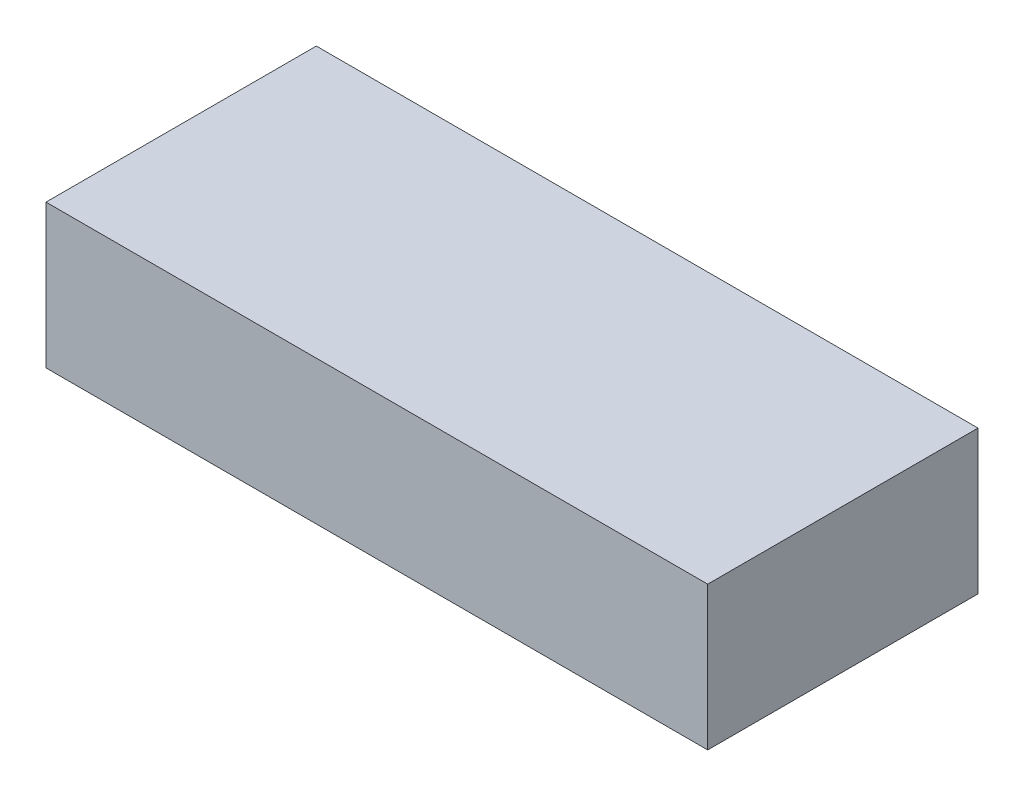
ISO-10303-21;
HEADER;
FILE_DESCRIPTION(('STEP AP214'),'2;1');
FILE_NAME('part.step','',(''),(''),'','','');
FILE_SCHEMA(('AUTOMOTIVE_DESIGN { 1 0 10303 214 1 1 1 1 }'));
ENDSEC;
DATA;
#1=APPLICATION_CONTEXT('core data for automotive mechanical design processes');
#2=APPLICATION_PROTOCOL_DEFINITION('international standard','automotive_design',2000,#1);
#3=PRODUCT_CONTEXT('',#1,'mechanical');
#4=PRODUCT('Part','Part','',(#3));
#5=PRODUCT_RELATED_PRODUCT_CATEGORY('part','',(#4));
#6=PRODUCT_DEFINITION_FORMATION('','',#4);
#7=PRODUCT_DEFINITION_CONTEXT('part definition',#1,'design');
#8=PRODUCT_DEFINITION('design','',#6,#7);
#9=PRODUCT_DEFINITION_SHAPE('','',#8);
#10=(LENGTH_UNIT() NAMED_UNIT(*) SI_UNIT(.MILLI.,.METRE.));
#11=(NAMED_UNIT(*) PLANE_ANGLE_UNIT() SI_UNIT($,.RADIAN.));
#12=(NAMED_UNIT(*) SI_UNIT($,.STERADIAN.) SOLID_ANGLE_UNIT());
#13=UNCERTAINTY_MEASURE_WITH_UNIT(LENGTH_MEASURE(1.E-05),#10,'distance_accuracy_value','');
#14=(GEOMETRIC_REPRESENTATION_CONTEXT(3) GLOBAL_UNCERTAINTY_ASSIGNED_CONTEXT((#13)) GLOBAL_UNIT_ASSIGNED_CONTEXT((#10,
#11,#12)) REPRESENTATION_CONTEXT('',''));
#15=CARTESIAN_POINT('',(0.,0.,0.));
#16=DIRECTION('',(0.,0.,1.));
#17=DIRECTION('',(1.,0.,0.));
#18=AXIS2_PLACEMENT_3D('',#15,#16,#17);
#19=CARTESIAN_POINT('',(117.5,-25.5,96.));
#20=DIRECTION('',(-1.,0.,0.));
#21=DIRECTION('',(0.,0.,1.));
#22=AXIS2_PLACEMENT_3D('',#19,#20,#21);
#23=PLANE('',#22);
#24=DIRECTION('',(0.,1.,0.));
#25=VECTOR('',#24,1.);
#26=CARTESIAN_POINT('',(117.5,-25.5,0.));
#27=LINE('',#26,#25);
#28=CARTESIAN_POINT('',(117.5,-25.5,0.));
#29=VERTEX_POINT('',#28);
#30=CARTESIAN_POINT('',(117.5,25.5,0.));
#31=VERTEX_POINT('',#30);
#32=EDGE_CURVE('E99',#29,#31,#27,.T.);
#33=ORIENTED_EDGE('',*,*,#32,.T.);
#34=DIRECTION('',(0.,0.,-1.));
#35=VECTOR('',#34,1.);
#36=CARTESIAN_POINT('',(117.5,25.5,96.));
#37=LINE('',#36,#35);
#38=CARTESIAN_POINT('',(117.5,25.5,96.));
#39=VERTEX_POINT('',#38);
#40=EDGE_CURVE('E11',#39,#31,#37,.T.);
#41=ORIENTED_EDGE('',*,*,#40,.F.);
#42=DIRECTION('',(0.,1.,0.));
#43=VECTOR('',#42,1.);
#44=CARTESIAN_POINT('',(117.5,-25.5,96.));
#45=LINE('',#44,#43);
#46=CARTESIAN_POINT('',(117.5,-25.5,96.));
#47=VERTEX_POINT('',#46);
#48=EDGE_CURVE('E87',#47,#39,#45,.T.);
#49=ORIENTED_EDGE('',*,*,#48,.F.);
#50=DIRECTION('',(0.,0.,-1.));
#51=VECTOR('',#50,1.);
#52=CARTESIAN_POINT('',(117.5,-25.5,96.));
#53=LINE('',#52,#51);
#54=EDGE_CURVE('E95',#47,#29,#53,.T.);
#55=ORIENTED_EDGE('',*,*,#54,.T.);
#56=EDGE_LOOP('',(#33,#41,#49,#55));
#57=FACE_BOUND('',#56,.T.);
#58=ADVANCED_FACE('F36',(#57),#23,.F.);
#59=CARTESIAN_POINT('',(-117.5,25.5,96.));
#60=DIRECTION('',(0.,-1.,0.));
#61=DIRECTION('',(0.,0.,-1.));
#62=AXIS2_PLACEMENT_3D('',#59,#60,#61);
#63=PLANE('',#62);
#64=DIRECTION('',(-1.,0.,0.));
#65=VECTOR('',#64,1.);
#66=CARTESIAN_POINT('',(-117.5,25.5,0.));
#67=LINE('',#66,#65);
#68=CARTESIAN_POINT('',(-117.5,25.5,0.));
#69=VERTEX_POINT('',#68);
#70=EDGE_CURVE('E91',#31,#69,#67,.T.);
#71=ORIENTED_EDGE('',*,*,#70,.T.);
#72=DIRECTION('',(0.,0.,-1.));
#73=VECTOR('',#72,1.);
#74=CARTESIAN_POINT('',(-117.5,25.5,96.));
#75=LINE('',#74,#73);
#76=CARTESIAN_POINT('',(-117.5,25.5,96.));
#77=VERTEX_POINT('',#76);
#78=EDGE_CURVE('E44',#77,#69,#75,.T.);
#79=ORIENTED_EDGE('',*,*,#78,.F.);
#80=DIRECTION('',(-1.,0.,0.));
#81=VECTOR('',#80,1.);
#82=CARTESIAN_POINT('',(-117.5,25.5,96.));
#83=LINE('',#82,#81);
#84=EDGE_CURVE('E82',#39,#77,#83,.T.);
#85=ORIENTED_EDGE('',*,*,#84,.F.);
#86=ORIENTED_EDGE('',*,*,#40,.T.);
#87=EDGE_LOOP('',(#71,#79,#85,#86));
#88=FACE_BOUND('',#87,.T.);
#89=ADVANCED_FACE('F90',(#88),#63,.F.);
#90=CARTESIAN_POINT('',(-117.5,-25.5,96.));
#91=DIRECTION('',(1.,0.,0.));
#92=DIRECTION('',(0.,0.,-1.));
#93=AXIS2_PLACEMENT_3D('',#90,#91,#92);
#94=PLANE('',#93);
#95=DIRECTION('',(0.,-1.,0.));
#96=VECTOR('',#95,1.);
#97=CARTESIAN_POINT('',(-117.5,-25.5,0.));
#98=LINE('',#97,#96);
#99=CARTESIAN_POINT('',(-117.5,-25.5,0.));
#100=VERTEX_POINT('',#99);
#101=EDGE_CURVE('E69',#69,#100,#98,.T.);
#102=ORIENTED_EDGE('',*,*,#101,.T.);
#103=DIRECTION('',(0.,0.,-1.));
#104=VECTOR('',#103,1.);
#105=CARTESIAN_POINT('',(-117.5,-25.5,96.));
#106=LINE('',#105,#104);
#107=CARTESIAN_POINT('',(-117.5,-25.5,96.));
#108=VERTEX_POINT('',#107);
#109=EDGE_CURVE('E92',#108,#100,#106,.T.);
#110=ORIENTED_EDGE('',*,*,#109,.F.);
#111=DIRECTION('',(0.,-1.,0.));
#112=VECTOR('',#111,1.);
#113=CARTESIAN_POINT('',(-117.5,-25.5,96.));
#114=LINE('',#113,#112);
#115=EDGE_CURVE('E85',#77,#108,#114,.T.);
#116=ORIENTED_EDGE('',*,*,#115,.F.);
#117=ORIENTED_EDGE('',*,*,#78,.T.);
#118=EDGE_LOOP('',(#102,#110,#116,#117));
#119=FACE_BOUND('',#118,.T.);
#120=ADVANCED_FACE('F93',(#119),#94,.F.);
#121=CARTESIAN_POINT('',(-117.5,-25.5,96.));
#122=DIRECTION('',(0.,1.,0.));
#123=DIRECTION('',(0.,0.,1.));
#124=AXIS2_PLACEMENT_3D('',#121,#122,#123);
#125=PLANE('',#124);
#126=DIRECTION('',(1.,0.,0.));
#127=VECTOR('',#126,1.);
#128=CARTESIAN_POINT('',(-117.5,-25.5,0.));
#129=LINE('',#128,#127);
#130=EDGE_CURVE('E75',#100,#29,#129,.T.);
#131=ORIENTED_EDGE('',*,*,#130,.T.);
#132=ORIENTED_EDGE('',*,*,#54,.F.);
#133=DIRECTION('',(1.,0.,0.));
#134=VECTOR('',#133,1.);
#135=CARTESIAN_POINT('',(-117.5,-25.5,96.));
#136=LINE('',#135,#134);
#137=EDGE_CURVE('E52',#108,#47,#136,.T.);
#138=ORIENTED_EDGE('',*,*,#137,.F.);
#139=ORIENTED_EDGE('',*,*,#109,.T.);
#140=EDGE_LOOP('',(#131,#132,#138,#139));
#141=FACE_BOUND('',#140,.T.);
#142=ADVANCED_FACE('F106',(#141),#125,.F.);
#143=CARTESIAN_POINT('',(0.,0.,96.));
#144=DIRECTION('',(0.,0.,-1.));
#145=DIRECTION('',(-1.,0.,0.));
#146=AXIS2_PLACEMENT_3D('',#143,#144,#145);
#147=PLANE('',#146);
#148=ORIENTED_EDGE('',*,*,#48,.T.);
#149=ORIENTED_EDGE('',*,*,#84,.T.);
#150=ORIENTED_EDGE('',*,*,#115,.T.);
#151=ORIENTED_EDGE('',*,*,#137,.T.);
#152=EDGE_LOOP('',(#148,#149,#150,#151));
#153=FACE_BOUND('',#152,.T.);
#154=ADVANCED_FACE('F83',(#153),#147,.F.);
#155=CARTESIAN_POINT('',(0.,0.,0.));
#156=DIRECTION('',(0.,0.,-1.));
#157=DIRECTION('',(-1.,0.,0.));
#158=AXIS2_PLACEMENT_3D('',#155,#156,#157);
#159=PLANE('',#158);
#160=ORIENTED_EDGE('',*,*,#32,.F.);
#161=ORIENTED_EDGE('',*,*,#130,.F.);
#162=ORIENTED_EDGE('',*,*,#101,.F.);
#163=ORIENTED_EDGE('',*,*,#70,.F.);
#164=EDGE_LOOP('',(#160,#161,#162,#163));
#165=FACE_BOUND('',#164,.T.);
#166=ADVANCED_FACE('F109',(#165),#159,.T.);
#167=CLOSED_SHELL('',(#58,#89,#120,#142,#154,#166));
#168=MANIFOLD_SOLID_BREP('B2',#167);
#169=ADVANCED_BREP_SHAPE_REPRESENTATION('',(#18,#168),#14);
#170=SHAPE_DEFINITION_REPRESENTATION(#9,#169);
ENDSEC;
END-ISO-10303-21;
